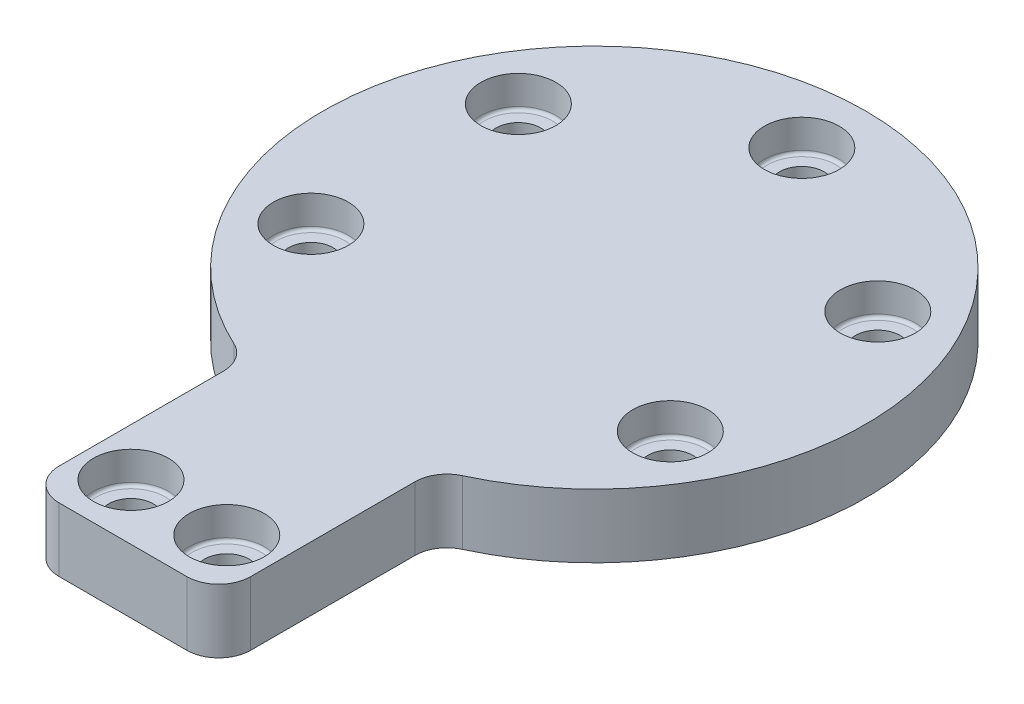
ISO-10303-21;
HEADER;
FILE_DESCRIPTION(('STEP AP214'),'2;1');
FILE_NAME('part.step','',(''),(''),'','','');
FILE_SCHEMA(('AUTOMOTIVE_DESIGN { 1 0 10303 214 1 1 1 1 }'));
ENDSEC;
DATA;
#1=APPLICATION_CONTEXT('core data for automotive mechanical design processes');
#2=APPLICATION_PROTOCOL_DEFINITION('international standard','automotive_design',2000,#1);
#3=PRODUCT_CONTEXT('',#1,'mechanical');
#4=PRODUCT('Part','Part','',(#3));
#5=PRODUCT_RELATED_PRODUCT_CATEGORY('part','',(#4));
#6=PRODUCT_DEFINITION_FORMATION('','',#4);
#7=PRODUCT_DEFINITION_CONTEXT('part definition',#1,'design');
#8=PRODUCT_DEFINITION('design','',#6,#7);
#9=PRODUCT_DEFINITION_SHAPE('','',#8);
#10=(LENGTH_UNIT() NAMED_UNIT(*) SI_UNIT(.MILLI.,.METRE.));
#11=(NAMED_UNIT(*) PLANE_ANGLE_UNIT() SI_UNIT($,.RADIAN.));
#12=(NAMED_UNIT(*) SI_UNIT($,.STERADIAN.) SOLID_ANGLE_UNIT());
#13=UNCERTAINTY_MEASURE_WITH_UNIT(LENGTH_MEASURE(1.E-05),#10,'distance_accuracy_value','');
#14=(GEOMETRIC_REPRESENTATION_CONTEXT(3) GLOBAL_UNCERTAINTY_ASSIGNED_CONTEXT((#13)) GLOBAL_UNIT_ASSIGNED_CONTEXT((#10,
#11,#12)) REPRESENTATION_CONTEXT('',''));
#15=CARTESIAN_POINT('',(0.,0.,0.));
#16=DIRECTION('',(0.,0.,1.));
#17=DIRECTION('',(1.,0.,0.));
#18=AXIS2_PLACEMENT_3D('',#15,#16,#17);
#19=CARTESIAN_POINT('',(3.,4.,26.03));
#20=DIRECTION('',(0.,-1.,0.));
#21=DIRECTION('',(0.,0.,-1.));
#22=AXIS2_PLACEMENT_3D('',#19,#20,#21);
#23=CYLINDRICAL_SURFACE('',#22,1.4);
#24=CARTESIAN_POINT('',(3.,0.,26.03));
#25=DIRECTION('',(0.,1.,0.));
#26=DIRECTION('',(0.,0.,1.));
#27=AXIS2_PLACEMENT_3D('',#24,#25,#26);
#28=CIRCLE('',#27,1.4);
#29=CARTESIAN_POINT('',(3.,0.,27.43));
#30=VERTEX_POINT('',#29);
#31=EDGE_CURVE('E236',#30,#30,#28,.T.);
#32=ORIENTED_EDGE('',*,*,#31,.F.);
#33=EDGE_LOOP('',(#32));
#34=FACE_BOUND('',#33,.T.);
#35=CARTESIAN_POINT('',(3.,2.,26.03));
#36=DIRECTION('',(0.,1.,0.));
#37=DIRECTION('',(0.,0.,1.));
#38=AXIS2_PLACEMENT_3D('',#35,#36,#37);
#39=CIRCLE('',#38,1.4);
#40=CARTESIAN_POINT('',(3.,2.,27.43));
#41=VERTEX_POINT('',#40);
#42=EDGE_CURVE('E157',#41,#41,#39,.T.);
#43=ORIENTED_EDGE('',*,*,#42,.T.);
#44=EDGE_LOOP('',(#43));
#45=FACE_BOUND('',#44,.T.);
#46=ADVANCED_FACE('F42',(#34,#45),#23,.F.);
#47=CARTESIAN_POINT('',(-3.,4.,26.03));
#48=DIRECTION('',(0.,-1.,0.));
#49=DIRECTION('',(0.,0.,-1.));
#50=AXIS2_PLACEMENT_3D('',#47,#48,#49);
#51=CYLINDRICAL_SURFACE('',#50,1.4);
#52=CARTESIAN_POINT('',(-3.,0.,26.03));
#53=DIRECTION('',(0.,1.,0.));
#54=DIRECTION('',(0.,0.,1.));
#55=AXIS2_PLACEMENT_3D('',#52,#53,#54);
#56=CIRCLE('',#55,1.4);
#57=CARTESIAN_POINT('',(-3.,0.,27.43));
#58=VERTEX_POINT('',#57);
#59=EDGE_CURVE('E260',#58,#58,#56,.T.);
#60=ORIENTED_EDGE('',*,*,#59,.F.);
#61=EDGE_LOOP('',(#60));
#62=FACE_BOUND('',#61,.T.);
#63=CARTESIAN_POINT('',(-3.,2.,26.03));
#64=DIRECTION('',(0.,1.,0.));
#65=DIRECTION('',(0.,0.,1.));
#66=AXIS2_PLACEMENT_3D('',#63,#64,#65);
#67=CIRCLE('',#66,1.4);
#68=CARTESIAN_POINT('',(-3.,2.,27.43));
#69=VERTEX_POINT('',#68);
#70=EDGE_CURVE('E154',#69,#69,#67,.T.);
#71=ORIENTED_EDGE('',*,*,#70,.T.);
#72=EDGE_LOOP('',(#71));
#73=FACE_BOUND('',#72,.T.);
#74=ADVANCED_FACE('F333',(#62,#73),#51,.F.);
#75=CARTESIAN_POINT('',(0.,4.,-13.));
#76=DIRECTION('',(0.,-1.,0.));
#77=DIRECTION('',(0.,0.,-1.));
#78=AXIS2_PLACEMENT_3D('',#75,#76,#77);
#79=CYLINDRICAL_SURFACE('',#78,1.4);
#80=CARTESIAN_POINT('',(0.,0.,-13.));
#81=DIRECTION('',(0.,1.,0.));
#82=DIRECTION('',(0.,0.,1.));
#83=AXIS2_PLACEMENT_3D('',#80,#81,#82);
#84=CIRCLE('',#83,1.4);
#85=CARTESIAN_POINT('',(0.,0.,-11.6));
#86=VERTEX_POINT('',#85);
#87=EDGE_CURVE('E263',#86,#86,#84,.T.);
#88=ORIENTED_EDGE('',*,*,#87,.F.);
#89=EDGE_LOOP('',(#88));
#90=FACE_BOUND('',#89,.T.);
#91=CARTESIAN_POINT('',(0.,2.,-13.));
#92=DIRECTION('',(0.,1.,0.));
#93=DIRECTION('',(0.,0.,1.));
#94=AXIS2_PLACEMENT_3D('',#91,#92,#93);
#95=CIRCLE('',#94,1.4);
#96=CARTESIAN_POINT('',(0.,2.,-11.6));
#97=VERTEX_POINT('',#96);
#98=EDGE_CURVE('E151',#97,#97,#95,.T.);
#99=ORIENTED_EDGE('',*,*,#98,.T.);
#100=EDGE_LOOP('',(#99));
#101=FACE_BOUND('',#100,.T.);
#102=ADVANCED_FACE('F340',(#90,#101),#79,.F.);
#103=CARTESIAN_POINT('',(11.2583302491977,4.,6.50000000000005));
#104=DIRECTION('',(0.,-1.,0.));
#105=DIRECTION('',(0.,0.,-1.));
#106=AXIS2_PLACEMENT_3D('',#103,#104,#105);
#107=CYLINDRICAL_SURFACE('',#106,1.4);
#108=CARTESIAN_POINT('',(11.2583302491977,0.,6.50000000000005));
#109=DIRECTION('',(0.,1.,0.));
#110=DIRECTION('',(0.,0.,1.));
#111=AXIS2_PLACEMENT_3D('',#108,#109,#110);
#112=CIRCLE('',#111,1.4);
#113=CARTESIAN_POINT('',(11.2583302491977,0.,7.90000000000005));
#114=VERTEX_POINT('',#113);
#115=EDGE_CURVE('E266',#114,#114,#112,.T.);
#116=ORIENTED_EDGE('',*,*,#115,.F.);
#117=EDGE_LOOP('',(#116));
#118=FACE_BOUND('',#117,.T.);
#119=CARTESIAN_POINT('',(11.2583302491977,2.,6.50000000000005));
#120=DIRECTION('',(0.,1.,0.));
#121=DIRECTION('',(0.,0.,1.));
#122=AXIS2_PLACEMENT_3D('',#119,#120,#121);
#123=CIRCLE('',#122,1.4);
#124=CARTESIAN_POINT('',(11.2583302491977,2.,7.90000000000005));
#125=VERTEX_POINT('',#124);
#126=EDGE_CURVE('E148',#125,#125,#123,.T.);
#127=ORIENTED_EDGE('',*,*,#126,.T.);
#128=EDGE_LOOP('',(#127));
#129=FACE_BOUND('',#128,.T.);
#130=ADVANCED_FACE('F582',(#118,#129),#107,.F.);
#131=CARTESIAN_POINT('',(-11.2583302491977,4.,6.49999999999998));
#132=DIRECTION('',(0.,-1.,0.));
#133=DIRECTION('',(0.,0.,-1.));
#134=AXIS2_PLACEMENT_3D('',#131,#132,#133);
#135=CYLINDRICAL_SURFACE('',#134,1.4);
#136=CARTESIAN_POINT('',(-11.2583302491977,0.,6.49999999999998));
#137=DIRECTION('',(0.,1.,0.));
#138=DIRECTION('',(0.,0.,1.));
#139=AXIS2_PLACEMENT_3D('',#136,#137,#138);
#140=CIRCLE('',#139,1.4);
#141=CARTESIAN_POINT('',(-11.2583302491977,0.,7.89999999999997));
#142=VERTEX_POINT('',#141);
#143=EDGE_CURVE('E269',#142,#142,#140,.T.);
#144=ORIENTED_EDGE('',*,*,#143,.F.);
#145=EDGE_LOOP('',(#144));
#146=FACE_BOUND('',#145,.T.);
#147=CARTESIAN_POINT('',(-11.2583302491977,2.,6.49999999999998));
#148=DIRECTION('',(0.,1.,0.));
#149=DIRECTION('',(0.,0.,1.));
#150=AXIS2_PLACEMENT_3D('',#147,#148,#149);
#151=CIRCLE('',#150,1.4);
#152=CARTESIAN_POINT('',(-11.2583302491977,2.,7.89999999999997));
#153=VERTEX_POINT('',#152);
#154=EDGE_CURVE('E145',#153,#153,#151,.T.);
#155=ORIENTED_EDGE('',*,*,#154,.T.);
#156=EDGE_LOOP('',(#155));
#157=FACE_BOUND('',#156,.T.);
#158=ADVANCED_FACE('F590',(#146,#157),#135,.F.);
#159=CARTESIAN_POINT('',(-11.2583302491977,4.,-6.49999999999997));
#160=DIRECTION('',(0.,-1.,0.));
#161=DIRECTION('',(0.,0.,-1.));
#162=AXIS2_PLACEMENT_3D('',#159,#160,#161);
#163=CYLINDRICAL_SURFACE('',#162,1.4);
#164=CARTESIAN_POINT('',(-11.2583302491977,0.,-6.49999999999997));
#165=DIRECTION('',(0.,1.,0.));
#166=DIRECTION('',(0.,0.,1.));
#167=AXIS2_PLACEMENT_3D('',#164,#165,#166);
#168=CIRCLE('',#167,1.4);
#169=CARTESIAN_POINT('',(-11.2583302491977,0.,-5.09999999999997));
#170=VERTEX_POINT('',#169);
#171=EDGE_CURVE('E272',#170,#170,#168,.T.);
#172=ORIENTED_EDGE('',*,*,#171,.F.);
#173=EDGE_LOOP('',(#172));
#174=FACE_BOUND('',#173,.T.);
#175=CARTESIAN_POINT('',(-11.2583302491977,2.,-6.49999999999997));
#176=DIRECTION('',(0.,1.,0.));
#177=DIRECTION('',(0.,0.,1.));
#178=AXIS2_PLACEMENT_3D('',#175,#176,#177);
#179=CIRCLE('',#178,1.4);
#180=CARTESIAN_POINT('',(-11.2583302491977,2.,-5.09999999999997));
#181=VERTEX_POINT('',#180);
#182=EDGE_CURVE('E141',#181,#181,#179,.T.);
#183=ORIENTED_EDGE('',*,*,#182,.T.);
#184=EDGE_LOOP('',(#183));
#185=FACE_BOUND('',#184,.T.);
#186=ADVANCED_FACE('F599',(#174,#185),#163,.F.);
#187=CARTESIAN_POINT('',(11.2583302491977,4.,-6.49999999999998));
#188=DIRECTION('',(0.,-1.,0.));
#189=DIRECTION('',(0.,0.,-1.));
#190=AXIS2_PLACEMENT_3D('',#187,#188,#189);
#191=CYLINDRICAL_SURFACE('',#190,1.4);
#192=CARTESIAN_POINT('',(11.2583302491977,0.,-6.49999999999998));
#193=DIRECTION('',(0.,1.,0.));
#194=DIRECTION('',(0.,0.,1.));
#195=AXIS2_PLACEMENT_3D('',#192,#193,#194);
#196=CIRCLE('',#195,1.4);
#197=CARTESIAN_POINT('',(11.2583302491977,0.,-5.09999999999998));
#198=VERTEX_POINT('',#197);
#199=EDGE_CURVE('E159',#198,#198,#196,.T.);
#200=ORIENTED_EDGE('',*,*,#199,.F.);
#201=EDGE_LOOP('',(#200));
#202=FACE_BOUND('',#201,.T.);
#203=CARTESIAN_POINT('',(11.2583302491977,2.,-6.49999999999998));
#204=DIRECTION('',(0.,1.,0.));
#205=DIRECTION('',(0.,0.,1.));
#206=AXIS2_PLACEMENT_3D('',#203,#204,#205);
#207=CIRCLE('',#206,1.4);
#208=CARTESIAN_POINT('',(11.2583302491977,2.,-5.09999999999998));
#209=VERTEX_POINT('',#208);
#210=EDGE_CURVE('E138',#209,#209,#207,.T.);
#211=ORIENTED_EDGE('',*,*,#210,.T.);
#212=EDGE_LOOP('',(#211));
#213=FACE_BOUND('',#212,.T.);
#214=ADVANCED_FACE('F302',(#202,#213),#191,.F.);
#215=CARTESIAN_POINT('',(-4.,4.,27.53));
#216=DIRECTION('',(0.,1.,0.));
#217=DIRECTION('',(0.,0.,1.));
#218=AXIS2_PLACEMENT_3D('',#215,#216,#217);
#219=PLANE('',#218);
#220=CARTESIAN_POINT('',(0.,4.,-13.));
#221=DIRECTION('',(0.,1.,0.));
#222=DIRECTION('',(0.,0.,1.));
#223=AXIS2_PLACEMENT_3D('',#220,#221,#222);
#224=CIRCLE('',#223,2.35);
#225=CARTESIAN_POINT('',(0.,4.,-10.65));
#226=VERTEX_POINT('',#225);
#227=EDGE_CURVE('E142',#226,#226,#224,.T.);
#228=ORIENTED_EDGE('',*,*,#227,.F.);
#229=EDGE_LOOP('',(#228));
#230=FACE_BOUND('',#229,.T.);
#231=CARTESIAN_POINT('',(11.2583302491977,4.,-6.49999999999998));
#232=DIRECTION('',(0.,1.,0.));
#233=DIRECTION('',(0.,0.,1.));
#234=AXIS2_PLACEMENT_3D('',#231,#232,#233);
#235=CIRCLE('',#234,2.35);
#236=CARTESIAN_POINT('',(11.2583302491977,4.,-4.14999999999997));
#237=VERTEX_POINT('',#236);
#238=EDGE_CURVE('E292',#237,#237,#235,.T.);
#239=ORIENTED_EDGE('',*,*,#238,.F.);
#240=EDGE_LOOP('',(#239));
#241=FACE_BOUND('',#240,.T.);
#242=CARTESIAN_POINT('',(11.2583302491977,4.,6.50000000000005));
#243=DIRECTION('',(0.,1.,0.));
#244=DIRECTION('',(0.,0.,1.));
#245=AXIS2_PLACEMENT_3D('',#242,#243,#244);
#246=CIRCLE('',#245,2.35);
#247=CARTESIAN_POINT('',(11.2583302491977,4.,8.85000000000005));
#248=VERTEX_POINT('',#247);
#249=EDGE_CURVE('E289',#248,#248,#246,.T.);
#250=ORIENTED_EDGE('',*,*,#249,.F.);
#251=EDGE_LOOP('',(#250));
#252=FACE_BOUND('',#251,.T.);
#253=CARTESIAN_POINT('',(-11.2583302491977,4.,6.49999999999998));
#254=DIRECTION('',(0.,1.,0.));
#255=DIRECTION('',(0.,0.,1.));
#256=AXIS2_PLACEMENT_3D('',#253,#254,#255);
#257=CIRCLE('',#256,2.35);
#258=CARTESIAN_POINT('',(-11.2583302491977,4.,8.84999999999998));
#259=VERTEX_POINT('',#258);
#260=EDGE_CURVE('E286',#259,#259,#257,.T.);
#261=ORIENTED_EDGE('',*,*,#260,.F.);
#262=EDGE_LOOP('',(#261));
#263=FACE_BOUND('',#262,.T.);
#264=CARTESIAN_POINT('',(-11.2583302491977,4.,-6.49999999999997));
#265=DIRECTION('',(0.,1.,0.));
#266=DIRECTION('',(0.,0.,1.));
#267=AXIS2_PLACEMENT_3D('',#264,#265,#266);
#268=CIRCLE('',#267,2.35);
#269=CARTESIAN_POINT('',(-11.2583302491977,4.,-4.14999999999997));
#270=VERTEX_POINT('',#269);
#271=EDGE_CURVE('E283',#270,#270,#268,.T.);
#272=ORIENTED_EDGE('',*,*,#271,.F.);
#273=EDGE_LOOP('',(#272));
#274=FACE_BOUND('',#273,.T.);
#275=CARTESIAN_POINT('',(-3.,4.,26.03));
#276=DIRECTION('',(0.,1.,0.));
#277=DIRECTION('',(0.,0.,1.));
#278=AXIS2_PLACEMENT_3D('',#275,#276,#277);
#279=CIRCLE('',#278,2.35);
#280=CARTESIAN_POINT('',(-3.,4.,28.38));
#281=VERTEX_POINT('',#280);
#282=EDGE_CURVE('E280',#281,#281,#279,.T.);
#283=ORIENTED_EDGE('',*,*,#282,.F.);
#284=EDGE_LOOP('',(#283));
#285=FACE_BOUND('',#284,.T.);
#286=CARTESIAN_POINT('',(3.,4.,26.03));
#287=DIRECTION('',(0.,1.,0.));
#288=DIRECTION('',(0.,0.,1.));
#289=AXIS2_PLACEMENT_3D('',#286,#287,#288);
#290=CIRCLE('',#289,2.35);
#291=CARTESIAN_POINT('',(3.,4.,28.38));
#292=VERTEX_POINT('',#291);
#293=EDGE_CURVE('E277',#292,#292,#290,.T.);
#294=ORIENTED_EDGE('',*,*,#293,.F.);
#295=EDGE_LOOP('',(#294));
#296=FACE_BOUND('',#295,.T.);
#297=CARTESIAN_POINT('',(-4.,4.,27.53));
#298=DIRECTION('',(0.,1.,0.));
#299=DIRECTION('',(0.,0.,1.));
#300=AXIS2_PLACEMENT_3D('',#297,#298,#299);
#301=CIRCLE('',#300,2.);
#302=CARTESIAN_POINT('',(-6.,4.,27.53));
#303=VERTEX_POINT('',#302);
#304=CARTESIAN_POINT('',(-4.,4.,29.53));
#305=VERTEX_POINT('',#304);
#306=EDGE_CURVE('E116',#303,#305,#301,.T.);
#307=ORIENTED_EDGE('',*,*,#306,.T.);
#308=DIRECTION('',(1.,0.,0.));
#309=VECTOR('',#308,1.);
#310=CARTESIAN_POINT('',(-4.,4.,29.53));
#311=LINE('',#310,#309);
#312=CARTESIAN_POINT('',(4.,4.,29.53));
#313=VERTEX_POINT('',#312);
#314=EDGE_CURVE('E106',#305,#313,#311,.T.);
#315=ORIENTED_EDGE('',*,*,#314,.T.);
#316=CARTESIAN_POINT('',(4.,4.,27.53));
#317=DIRECTION('',(0.,1.,0.));
#318=DIRECTION('',(0.,0.,-1.));
#319=AXIS2_PLACEMENT_3D('',#316,#317,#318);
#320=CIRCLE('',#319,2.);
#321=CARTESIAN_POINT('',(6.,4.,27.53));
#322=VERTEX_POINT('',#321);
#323=EDGE_CURVE('E115',#313,#322,#320,.T.);
#324=ORIENTED_EDGE('',*,*,#323,.T.);
#325=DIRECTION('',(0.,0.,-1.));
#326=VECTOR('',#325,1.);
#327=CARTESIAN_POINT('',(6.,4.,22.03));
#328=LINE('',#327,#326);
#329=CARTESIAN_POINT('',(6.,4.,17.2336879396141));
#330=VERTEX_POINT('',#329);
#331=EDGE_CURVE('E230',#322,#330,#328,.T.);
#332=ORIENTED_EDGE('',*,*,#331,.T.);
#333=CARTESIAN_POINT('',(8.,4.,17.2336879396141));
#334=DIRECTION('',(0.,1.,0.));
#335=DIRECTION('',(0.,0.,1.));
#336=AXIS2_PLACEMENT_3D('',#333,#334,#335);
#337=CIRCLE('',#336,2.);
#338=CARTESIAN_POINT('',(7.15789473684211,4.,15.4196155249179));
#339=VERTEX_POINT('',#338);
#340=EDGE_CURVE('E210',#330,#339,#337,.F.);
#341=ORIENTED_EDGE('',*,*,#340,.T.);
#342=CARTESIAN_POINT('',(0.,4.,0.));
#343=DIRECTION('',(0.,1.,0.));
#344=DIRECTION('',(0.,0.,-1.));
#345=AXIS2_PLACEMENT_3D('',#342,#343,#344);
#346=CIRCLE('',#345,17.);
#347=CARTESIAN_POINT('',(-7.1578947368421,4.,15.4196155249179));
#348=VERTEX_POINT('',#347);
#349=EDGE_CURVE('E227',#339,#348,#346,.T.);
#350=ORIENTED_EDGE('',*,*,#349,.T.);
#351=CARTESIAN_POINT('',(-8.,4.,17.2336879396141));
#352=DIRECTION('',(0.,1.,0.));
#353=DIRECTION('',(0.,0.,1.));
#354=AXIS2_PLACEMENT_3D('',#351,#352,#353);
#355=CIRCLE('',#354,2.);
#356=CARTESIAN_POINT('',(-6.,4.,17.2336879396141));
#357=VERTEX_POINT('',#356);
#358=EDGE_CURVE('E11',#348,#357,#355,.F.);
#359=ORIENTED_EDGE('',*,*,#358,.T.);
#360=DIRECTION('',(0.,0.,1.));
#361=VECTOR('',#360,1.);
#362=CARTESIAN_POINT('',(-6.,4.,22.03));
#363=LINE('',#362,#361);
#364=EDGE_CURVE('E120',#357,#303,#363,.T.);
#365=ORIENTED_EDGE('',*,*,#364,.T.);
#366=EDGE_LOOP('',(#307,#315,#324,#332,#341,#350,#359,#365));
#367=FACE_BOUND('',#366,.T.);
#368=ADVANCED_FACE('F119',(#230,#241,#252,#263,#274,#285,#296,#367),#219,.T.);
#369=CARTESIAN_POINT('',(-4.,0.,27.53));
#370=DIRECTION('',(0.,1.,0.));
#371=DIRECTION('',(0.,0.,1.));
#372=AXIS2_PLACEMENT_3D('',#369,#370,#371);
#373=PLANE('',#372);
#374=CARTESIAN_POINT('',(-4.,0.,27.53));
#375=DIRECTION('',(0.,1.,0.));
#376=DIRECTION('',(0.,0.,1.));
#377=AXIS2_PLACEMENT_3D('',#374,#375,#376);
#378=CIRCLE('',#377,2.);
#379=CARTESIAN_POINT('',(-6.,0.,27.53));
#380=VERTEX_POINT('',#379);
#381=CARTESIAN_POINT('',(-4.,0.,29.53));
#382=VERTEX_POINT('',#381);
#383=EDGE_CURVE('E128',#380,#382,#378,.T.);
#384=ORIENTED_EDGE('',*,*,#383,.F.);
#385=DIRECTION('',(0.,0.,1.));
#386=VECTOR('',#385,1.);
#387=CARTESIAN_POINT('',(-6.,0.,22.03));
#388=LINE('',#387,#386);
#389=CARTESIAN_POINT('',(-6.,0.,17.2336879396141));
#390=VERTEX_POINT('',#389);
#391=EDGE_CURVE('E124',#390,#380,#388,.T.);
#392=ORIENTED_EDGE('',*,*,#391,.F.);
#393=CARTESIAN_POINT('',(-8.,0.,17.2336879396141));
#394=DIRECTION('',(0.,1.,0.));
#395=DIRECTION('',(0.,0.,1.));
#396=AXIS2_PLACEMENT_3D('',#393,#394,#395);
#397=CIRCLE('',#396,2.);
#398=CARTESIAN_POINT('',(-7.1578947368421,0.,15.4196155249179));
#399=VERTEX_POINT('',#398);
#400=EDGE_CURVE('E50',#390,#399,#397,.T.);
#401=ORIENTED_EDGE('',*,*,#400,.T.);
#402=CARTESIAN_POINT('',(0.,0.,0.));
#403=DIRECTION('',(0.,1.,0.));
#404=DIRECTION('',(0.,0.,-1.));
#405=AXIS2_PLACEMENT_3D('',#402,#403,#404);
#406=CIRCLE('',#405,17.);
#407=CARTESIAN_POINT('',(7.15789473684211,0.,15.4196155249179));
#408=VERTEX_POINT('',#407);
#409=EDGE_CURVE('E217',#408,#399,#406,.T.);
#410=ORIENTED_EDGE('',*,*,#409,.F.);
#411=CARTESIAN_POINT('',(8.,0.,17.2336879396141));
#412=DIRECTION('',(0.,1.,0.));
#413=DIRECTION('',(0.,0.,1.));
#414=AXIS2_PLACEMENT_3D('',#411,#412,#413);
#415=CIRCLE('',#414,2.);
#416=CARTESIAN_POINT('',(6.,0.,17.2336879396141));
#417=VERTEX_POINT('',#416);
#418=EDGE_CURVE('E208',#408,#417,#415,.T.);
#419=ORIENTED_EDGE('',*,*,#418,.T.);
#420=DIRECTION('',(0.,0.,-1.));
#421=VECTOR('',#420,1.);
#422=CARTESIAN_POINT('',(6.,0.,22.03));
#423=LINE('',#422,#421);
#424=CARTESIAN_POINT('',(6.,0.,27.53));
#425=VERTEX_POINT('',#424);
#426=EDGE_CURVE('E222',#425,#417,#423,.T.);
#427=ORIENTED_EDGE('',*,*,#426,.F.);
#428=CARTESIAN_POINT('',(4.,0.,27.53));
#429=DIRECTION('',(0.,1.,0.));
#430=DIRECTION('',(0.,0.,-1.));
#431=AXIS2_PLACEMENT_3D('',#428,#429,#430);
#432=CIRCLE('',#431,2.);
#433=CARTESIAN_POINT('',(4.,0.,29.53));
#434=VERTEX_POINT('',#433);
#435=EDGE_CURVE('E238',#434,#425,#432,.T.);
#436=ORIENTED_EDGE('',*,*,#435,.F.);
#437=DIRECTION('',(1.,0.,0.));
#438=VECTOR('',#437,1.);
#439=CARTESIAN_POINT('',(-4.,0.,29.53));
#440=LINE('',#439,#438);
#441=EDGE_CURVE('E235',#382,#434,#440,.T.);
#442=ORIENTED_EDGE('',*,*,#441,.F.);
#443=EDGE_LOOP('',(#384,#392,#401,#410,#419,#427,#436,#442));
#444=FACE_BOUND('',#443,.T.);
#445=ORIENTED_EDGE('',*,*,#31,.T.);
#446=EDGE_LOOP('',(#445));
#447=FACE_BOUND('',#446,.T.);
#448=ORIENTED_EDGE('',*,*,#59,.T.);
#449=EDGE_LOOP('',(#448));
#450=FACE_BOUND('',#449,.T.);
#451=ORIENTED_EDGE('',*,*,#87,.T.);
#452=EDGE_LOOP('',(#451));
#453=FACE_BOUND('',#452,.T.);
#454=ORIENTED_EDGE('',*,*,#115,.T.);
#455=EDGE_LOOP('',(#454));
#456=FACE_BOUND('',#455,.T.);
#457=ORIENTED_EDGE('',*,*,#143,.T.);
#458=EDGE_LOOP('',(#457));
#459=FACE_BOUND('',#458,.T.);
#460=ORIENTED_EDGE('',*,*,#171,.T.);
#461=EDGE_LOOP('',(#460));
#462=FACE_BOUND('',#461,.T.);
#463=ORIENTED_EDGE('',*,*,#199,.T.);
#464=EDGE_LOOP('',(#463));
#465=FACE_BOUND('',#464,.T.);
#466=ADVANCED_FACE('F215',(#444,#447,#450,#453,#456,#459,#462,#465),#373,.F.);
#467=CARTESIAN_POINT('',(-4.,4.,27.53));
#468=DIRECTION('',(0.,-1.,0.));
#469=DIRECTION('',(0.,0.,-1.));
#470=AXIS2_PLACEMENT_3D('',#467,#468,#469);
#471=CYLINDRICAL_SURFACE('',#470,2.);
#472=ORIENTED_EDGE('',*,*,#383,.T.);
#473=DIRECTION('',(0.,-1.,0.));
#474=VECTOR('',#473,1.);
#475=CARTESIAN_POINT('',(-4.,4.,29.53));
#476=LINE('',#475,#474);
#477=EDGE_CURVE('E110',#305,#382,#476,.T.);
#478=ORIENTED_EDGE('',*,*,#477,.F.);
#479=ORIENTED_EDGE('',*,*,#306,.F.);
#480=DIRECTION('',(0.,-1.,0.));
#481=VECTOR('',#480,1.);
#482=CARTESIAN_POINT('',(-6.,4.,27.53));
#483=LINE('',#482,#481);
#484=EDGE_CURVE('E226',#303,#380,#483,.T.);
#485=ORIENTED_EDGE('',*,*,#484,.T.);
#486=EDGE_LOOP('',(#472,#478,#479,#485));
#487=FACE_BOUND('',#486,.T.);
#488=ADVANCED_FACE('F126',(#487),#471,.T.);
#489=CARTESIAN_POINT('',(-4.,4.,29.53));
#490=DIRECTION('',(0.,0.,-1.));
#491=DIRECTION('',(-1.,0.,0.));
#492=AXIS2_PLACEMENT_3D('',#489,#490,#491);
#493=PLANE('',#492);
#494=ORIENTED_EDGE('',*,*,#441,.T.);
#495=DIRECTION('',(0.,-1.,0.));
#496=VECTOR('',#495,1.);
#497=CARTESIAN_POINT('',(4.,4.,29.53));
#498=LINE('',#497,#496);
#499=EDGE_CURVE('E113',#313,#434,#498,.T.);
#500=ORIENTED_EDGE('',*,*,#499,.F.);
#501=ORIENTED_EDGE('',*,*,#314,.F.);
#502=ORIENTED_EDGE('',*,*,#477,.T.);
#503=EDGE_LOOP('',(#494,#500,#501,#502));
#504=FACE_BOUND('',#503,.T.);
#505=ADVANCED_FACE('F108',(#504),#493,.F.);
#506=CARTESIAN_POINT('',(4.,4.,27.53));
#507=DIRECTION('',(0.,-1.,0.));
#508=DIRECTION('',(0.,0.,-1.));
#509=AXIS2_PLACEMENT_3D('',#506,#507,#508);
#510=CYLINDRICAL_SURFACE('',#509,2.);
#511=ORIENTED_EDGE('',*,*,#435,.T.);
#512=DIRECTION('',(0.,-1.,0.));
#513=VECTOR('',#512,1.);
#514=CARTESIAN_POINT('',(6.,4.,27.53));
#515=LINE('',#514,#513);
#516=EDGE_CURVE('E134',#322,#425,#515,.T.);
#517=ORIENTED_EDGE('',*,*,#516,.F.);
#518=ORIENTED_EDGE('',*,*,#323,.F.);
#519=ORIENTED_EDGE('',*,*,#499,.T.);
#520=EDGE_LOOP('',(#511,#517,#518,#519));
#521=FACE_BOUND('',#520,.T.);
#522=ADVANCED_FACE('F251',(#521),#510,.T.);
#523=CARTESIAN_POINT('',(6.,4.,22.03));
#524=DIRECTION('',(-1.,0.,0.));
#525=DIRECTION('',(0.,0.,1.));
#526=AXIS2_PLACEMENT_3D('',#523,#524,#525);
#527=PLANE('',#526);
#528=ORIENTED_EDGE('',*,*,#426,.T.);
#529=DIRECTION('',(0.,1.,0.));
#530=VECTOR('',#529,1.);
#531=CARTESIAN_POINT('',(6.,4.,17.2336879396141));
#532=LINE('',#531,#530);
#533=EDGE_CURVE('E204',#417,#330,#532,.T.);
#534=ORIENTED_EDGE('',*,*,#533,.T.);
#535=ORIENTED_EDGE('',*,*,#331,.F.);
#536=ORIENTED_EDGE('',*,*,#516,.T.);
#537=EDGE_LOOP('',(#528,#534,#535,#536));
#538=FACE_BOUND('',#537,.T.);
#539=ADVANCED_FACE('F247',(#538),#527,.F.);
#540=CARTESIAN_POINT('',(0.,4.,0.));
#541=DIRECTION('',(0.,-1.,0.));
#542=DIRECTION('',(0.,0.,-1.));
#543=AXIS2_PLACEMENT_3D('',#540,#541,#542);
#544=CYLINDRICAL_SURFACE('',#543,17.);
#545=ORIENTED_EDGE('',*,*,#349,.F.);
#546=DIRECTION('',(0.,-1.,0.));
#547=VECTOR('',#546,1.);
#548=CARTESIAN_POINT('',(7.15789473684211,4.,15.4196155249179));
#549=LINE('',#548,#547);
#550=EDGE_CURVE('E201',#339,#408,#549,.T.);
#551=ORIENTED_EDGE('',*,*,#550,.T.);
#552=ORIENTED_EDGE('',*,*,#409,.T.);
#553=DIRECTION('',(0.,-1.,0.));
#554=VECTOR('',#553,1.);
#555=CARTESIAN_POINT('',(-7.1578947368421,4.,15.4196155249179));
#556=LINE('',#555,#554);
#557=EDGE_CURVE('E199',#399,#348,#556,.F.);
#558=ORIENTED_EDGE('',*,*,#557,.T.);
#559=EDGE_LOOP('',(#545,#551,#552,#558));
#560=FACE_BOUND('',#559,.T.);
#561=ADVANCED_FACE('F220',(#560),#544,.T.);
#562=CARTESIAN_POINT('',(-6.,4.,22.03));
#563=DIRECTION('',(1.,0.,0.));
#564=DIRECTION('',(0.,0.,-1.));
#565=AXIS2_PLACEMENT_3D('',#562,#563,#564);
#566=PLANE('',#565);
#567=ORIENTED_EDGE('',*,*,#364,.F.);
#568=DIRECTION('',(0.,1.,0.));
#569=VECTOR('',#568,1.);
#570=CARTESIAN_POINT('',(-6.,0.,17.2336879396141));
#571=LINE('',#570,#569);
#572=EDGE_CURVE('E206',#357,#390,#571,.F.);
#573=ORIENTED_EDGE('',*,*,#572,.T.);
#574=ORIENTED_EDGE('',*,*,#391,.T.);
#575=ORIENTED_EDGE('',*,*,#484,.F.);
#576=EDGE_LOOP('',(#567,#573,#574,#575));
#577=FACE_BOUND('',#576,.T.);
#578=ADVANCED_FACE('F225',(#577),#566,.F.);
#579=CARTESIAN_POINT('',(11.2583302491977,2.,-6.49999999999998));
#580=DIRECTION('',(0.,1.,0.));
#581=DIRECTION('',(0.,0.,1.));
#582=AXIS2_PLACEMENT_3D('',#579,#580,#581);
#583=CYLINDRICAL_SURFACE('',#582,2.35);
#584=CARTESIAN_POINT('',(11.2583302491977,2.2,-6.49999999999998));
#585=DIRECTION('',(0.,1.,0.));
#586=DIRECTION('',(0.,0.,1.));
#587=AXIS2_PLACEMENT_3D('',#584,#585,#586);
#588=CIRCLE('',#587,2.35);
#589=CARTESIAN_POINT('',(11.2583302491977,2.2,-4.14999999999997));
#590=VERTEX_POINT('',#589);
#591=EDGE_CURVE('E190',#590,#590,#588,.F.);
#592=ORIENTED_EDGE('',*,*,#591,.T.);
#593=EDGE_LOOP('',(#592));
#594=FACE_BOUND('',#593,.T.);
#595=ORIENTED_EDGE('',*,*,#238,.T.);
#596=EDGE_LOOP('',(#595));
#597=FACE_BOUND('',#596,.T.);
#598=ADVANCED_FACE('F351',(#594,#597),#583,.F.);
#599=CARTESIAN_POINT('',(11.2583302491977,2.,-6.49999999999998));
#600=DIRECTION('',(0.,1.,0.));
#601=DIRECTION('',(0.,0.,1.));
#602=AXIS2_PLACEMENT_3D('',#599,#600,#601);
#603=PLANE('',#602);
#604=CARTESIAN_POINT('',(11.2583302491977,2.,-6.49999999999998));
#605=DIRECTION('',(0.,1.,0.));
#606=DIRECTION('',(0.,0.,1.));
#607=AXIS2_PLACEMENT_3D('',#604,#605,#606);
#608=CIRCLE('',#607,2.15);
#609=CARTESIAN_POINT('',(11.2583302491977,2.,-4.34999999999998));
#610=VERTEX_POINT('',#609);
#611=EDGE_CURVE('E187',#610,#610,#608,.T.);
#612=ORIENTED_EDGE('',*,*,#611,.T.);
#613=EDGE_LOOP('',(#612));
#614=FACE_BOUND('',#613,.T.);
#615=ORIENTED_EDGE('',*,*,#210,.F.);
#616=EDGE_LOOP('',(#615));
#617=FACE_BOUND('',#616,.T.);
#618=ADVANCED_FACE('F544',(#614,#617),#603,.T.);
#619=CARTESIAN_POINT('',(-11.2583302491977,2.,-6.49999999999997));
#620=DIRECTION('',(0.,1.,0.));
#621=DIRECTION('',(0.,0.,1.));
#622=AXIS2_PLACEMENT_3D('',#619,#620,#621);
#623=CYLINDRICAL_SURFACE('',#622,2.35);
#624=CARTESIAN_POINT('',(-11.2583302491977,2.2,-6.49999999999997));
#625=DIRECTION('',(0.,1.,0.));
#626=DIRECTION('',(0.,0.,1.));
#627=AXIS2_PLACEMENT_3D('',#624,#625,#626);
#628=CIRCLE('',#627,2.35);
#629=CARTESIAN_POINT('',(-11.2583302491977,2.2,-4.14999999999997));
#630=VERTEX_POINT('',#629);
#631=EDGE_CURVE('E178',#630,#630,#628,.F.);
#632=ORIENTED_EDGE('',*,*,#631,.T.);
#633=EDGE_LOOP('',(#632));
#634=FACE_BOUND('',#633,.T.);
#635=ORIENTED_EDGE('',*,*,#271,.T.);
#636=EDGE_LOOP('',(#635));
#637=FACE_BOUND('',#636,.T.);
#638=ADVANCED_FACE('F534',(#634,#637),#623,.F.);
#639=CARTESIAN_POINT('',(-11.2583302491977,2.,-6.49999999999997));
#640=DIRECTION('',(0.,1.,0.));
#641=DIRECTION('',(0.,0.,1.));
#642=AXIS2_PLACEMENT_3D('',#639,#640,#641);
#643=PLANE('',#642);
#644=CARTESIAN_POINT('',(-11.2583302491977,2.,-6.49999999999997));
#645=DIRECTION('',(0.,1.,0.));
#646=DIRECTION('',(0.,0.,1.));
#647=AXIS2_PLACEMENT_3D('',#644,#645,#646);
#648=CIRCLE('',#647,2.15);
#649=CARTESIAN_POINT('',(-11.2583302491977,2.,-4.34999999999997));
#650=VERTEX_POINT('',#649);
#651=EDGE_CURVE('E175',#650,#650,#648,.T.);
#652=ORIENTED_EDGE('',*,*,#651,.T.);
#653=EDGE_LOOP('',(#652));
#654=FACE_BOUND('',#653,.T.);
#655=ORIENTED_EDGE('',*,*,#182,.F.);
#656=EDGE_LOOP('',(#655));
#657=FACE_BOUND('',#656,.T.);
#658=ADVANCED_FACE('F524',(#654,#657),#643,.T.);
#659=CARTESIAN_POINT('',(-11.2583302491977,2.,6.49999999999998));
#660=DIRECTION('',(0.,1.,0.));
#661=DIRECTION('',(0.,0.,1.));
#662=AXIS2_PLACEMENT_3D('',#659,#660,#661);
#663=CYLINDRICAL_SURFACE('',#662,2.35);
#664=CARTESIAN_POINT('',(-11.2583302491977,2.2,6.49999999999998));
#665=DIRECTION('',(0.,1.,0.));
#666=DIRECTION('',(0.,0.,1.));
#667=AXIS2_PLACEMENT_3D('',#664,#665,#666);
#668=CIRCLE('',#667,2.35);
#669=CARTESIAN_POINT('',(-11.2583302491977,2.2,8.84999999999998));
#670=VERTEX_POINT('',#669);
#671=EDGE_CURVE('E172',#670,#670,#668,.F.);
#672=ORIENTED_EDGE('',*,*,#671,.T.);
#673=EDGE_LOOP('',(#672));
#674=FACE_BOUND('',#673,.T.);
#675=ORIENTED_EDGE('',*,*,#260,.T.);
#676=EDGE_LOOP('',(#675));
#677=FACE_BOUND('',#676,.T.);
#678=ADVANCED_FACE('F514',(#674,#677),#663,.F.);
#679=CARTESIAN_POINT('',(-11.2583302491977,2.,6.49999999999998));
#680=DIRECTION('',(0.,1.,0.));
#681=DIRECTION('',(0.,0.,1.));
#682=AXIS2_PLACEMENT_3D('',#679,#680,#681);
#683=PLANE('',#682);
#684=CARTESIAN_POINT('',(-11.2583302491977,2.,6.49999999999998));
#685=DIRECTION('',(0.,1.,0.));
#686=DIRECTION('',(0.,0.,1.));
#687=AXIS2_PLACEMENT_3D('',#684,#685,#686);
#688=CIRCLE('',#687,2.15);
#689=CARTESIAN_POINT('',(-11.2583302491977,2.,8.64999999999998));
#690=VERTEX_POINT('',#689);
#691=EDGE_CURVE('E169',#690,#690,#688,.T.);
#692=ORIENTED_EDGE('',*,*,#691,.T.);
#693=EDGE_LOOP('',(#692));
#694=FACE_BOUND('',#693,.T.);
#695=ORIENTED_EDGE('',*,*,#154,.F.);
#696=EDGE_LOOP('',(#695));
#697=FACE_BOUND('',#696,.T.);
#698=ADVANCED_FACE('F504',(#694,#697),#683,.T.);
#699=CARTESIAN_POINT('',(11.2583302491977,2.,6.50000000000005));
#700=DIRECTION('',(0.,1.,0.));
#701=DIRECTION('',(0.,0.,1.));
#702=AXIS2_PLACEMENT_3D('',#699,#700,#701);
#703=CYLINDRICAL_SURFACE('',#702,2.35);
#704=CARTESIAN_POINT('',(11.2583302491977,2.2,6.50000000000005));
#705=DIRECTION('',(0.,1.,0.));
#706=DIRECTION('',(0.,0.,1.));
#707=AXIS2_PLACEMENT_3D('',#704,#705,#706);
#708=CIRCLE('',#707,2.35);
#709=CARTESIAN_POINT('',(11.2583302491977,2.2,8.85000000000005));
#710=VERTEX_POINT('',#709);
#711=EDGE_CURVE('E184',#710,#710,#708,.F.);
#712=ORIENTED_EDGE('',*,*,#711,.T.);
#713=EDGE_LOOP('',(#712));
#714=FACE_BOUND('',#713,.T.);
#715=ORIENTED_EDGE('',*,*,#249,.T.);
#716=EDGE_LOOP('',(#715));
#717=FACE_BOUND('',#716,.T.);
#718=ADVANCED_FACE('F494',(#714,#717),#703,.F.);
#719=CARTESIAN_POINT('',(11.2583302491977,2.,6.50000000000005));
#720=DIRECTION('',(0.,1.,0.));
#721=DIRECTION('',(0.,0.,1.));
#722=AXIS2_PLACEMENT_3D('',#719,#720,#721);
#723=PLANE('',#722);
#724=CARTESIAN_POINT('',(11.2583302491977,2.,6.50000000000005));
#725=DIRECTION('',(0.,1.,0.));
#726=DIRECTION('',(0.,0.,1.));
#727=AXIS2_PLACEMENT_3D('',#724,#725,#726);
#728=CIRCLE('',#727,2.15);
#729=CARTESIAN_POINT('',(11.2583302491977,2.,8.65000000000005));
#730=VERTEX_POINT('',#729);
#731=EDGE_CURVE('E181',#730,#730,#728,.T.);
#732=ORIENTED_EDGE('',*,*,#731,.T.);
#733=EDGE_LOOP('',(#732));
#734=FACE_BOUND('',#733,.T.);
#735=ORIENTED_EDGE('',*,*,#126,.F.);
#736=EDGE_LOOP('',(#735));
#737=FACE_BOUND('',#736,.T.);
#738=ADVANCED_FACE('F484',(#734,#737),#723,.T.);
#739=CARTESIAN_POINT('',(0.,2.,-13.));
#740=DIRECTION('',(0.,1.,0.));
#741=DIRECTION('',(0.,0.,1.));
#742=AXIS2_PLACEMENT_3D('',#739,#740,#741);
#743=CYLINDRICAL_SURFACE('',#742,2.35);
#744=CARTESIAN_POINT('',(0.,2.2,-13.));
#745=DIRECTION('',(0.,1.,0.));
#746=DIRECTION('',(0.,0.,1.));
#747=AXIS2_PLACEMENT_3D('',#744,#745,#746);
#748=CIRCLE('',#747,2.35);
#749=CARTESIAN_POINT('',(0.,2.2,-10.65));
#750=VERTEX_POINT('',#749);
#751=EDGE_CURVE('E196',#750,#750,#748,.F.);
#752=ORIENTED_EDGE('',*,*,#751,.T.);
#753=EDGE_LOOP('',(#752));
#754=FACE_BOUND('',#753,.T.);
#755=ORIENTED_EDGE('',*,*,#227,.T.);
#756=EDGE_LOOP('',(#755));
#757=FACE_BOUND('',#756,.T.);
#758=ADVANCED_FACE('F298',(#754,#757),#743,.F.);
#759=CARTESIAN_POINT('',(0.,2.,-13.));
#760=DIRECTION('',(0.,1.,0.));
#761=DIRECTION('',(0.,0.,1.));
#762=AXIS2_PLACEMENT_3D('',#759,#760,#761);
#763=PLANE('',#762);
#764=CARTESIAN_POINT('',(0.,2.,-13.));
#765=DIRECTION('',(0.,1.,0.));
#766=DIRECTION('',(0.,0.,1.));
#767=AXIS2_PLACEMENT_3D('',#764,#765,#766);
#768=CIRCLE('',#767,2.15);
#769=CARTESIAN_POINT('',(0.,2.,-10.85));
#770=VERTEX_POINT('',#769);
#771=EDGE_CURVE('E193',#770,#770,#768,.T.);
#772=ORIENTED_EDGE('',*,*,#771,.T.);
#773=EDGE_LOOP('',(#772));
#774=FACE_BOUND('',#773,.T.);
#775=ORIENTED_EDGE('',*,*,#98,.F.);
#776=EDGE_LOOP('',(#775));
#777=FACE_BOUND('',#776,.T.);
#778=ADVANCED_FACE('F465',(#774,#777),#763,.T.);
#779=CARTESIAN_POINT('',(-3.,2.,26.03));
#780=DIRECTION('',(0.,1.,0.));
#781=DIRECTION('',(0.,0.,1.));
#782=AXIS2_PLACEMENT_3D('',#779,#780,#781);
#783=CYLINDRICAL_SURFACE('',#782,2.35);
#784=CARTESIAN_POINT('',(-3.,2.2,26.03));
#785=DIRECTION('',(0.,1.,0.));
#786=DIRECTION('',(0.,0.,1.));
#787=AXIS2_PLACEMENT_3D('',#784,#785,#786);
#788=CIRCLE('',#787,2.35);
#789=CARTESIAN_POINT('',(-3.,2.2,28.38));
#790=VERTEX_POINT('',#789);
#791=EDGE_CURVE('E132',#790,#790,#788,.F.);
#792=ORIENTED_EDGE('',*,*,#791,.T.);
#793=EDGE_LOOP('',(#792));
#794=FACE_BOUND('',#793,.T.);
#795=ORIENTED_EDGE('',*,*,#282,.T.);
#796=EDGE_LOOP('',(#795));
#797=FACE_BOUND('',#796,.T.);
#798=ADVANCED_FACE('F329',(#794,#797),#783,.F.);
#799=CARTESIAN_POINT('',(-3.,2.,26.03));
#800=DIRECTION('',(0.,1.,0.));
#801=DIRECTION('',(0.,0.,1.));
#802=AXIS2_PLACEMENT_3D('',#799,#800,#801);
#803=PLANE('',#802);
#804=CARTESIAN_POINT('',(-3.,2.,26.03));
#805=DIRECTION('',(0.,1.,0.));
#806=DIRECTION('',(0.,0.,1.));
#807=AXIS2_PLACEMENT_3D('',#804,#805,#806);
#808=CIRCLE('',#807,2.15);
#809=CARTESIAN_POINT('',(-3.,2.,28.18));
#810=VERTEX_POINT('',#809);
#811=EDGE_CURVE('E129',#810,#810,#808,.T.);
#812=ORIENTED_EDGE('',*,*,#811,.T.);
#813=EDGE_LOOP('',(#812));
#814=FACE_BOUND('',#813,.T.);
#815=ORIENTED_EDGE('',*,*,#70,.F.);
#816=EDGE_LOOP('',(#815));
#817=FACE_BOUND('',#816,.T.);
#818=ADVANCED_FACE('F319',(#814,#817),#803,.T.);
#819=CARTESIAN_POINT('',(3.,2.,26.03));
#820=DIRECTION('',(0.,1.,0.));
#821=DIRECTION('',(0.,0.,1.));
#822=AXIS2_PLACEMENT_3D('',#819,#820,#821);
#823=CYLINDRICAL_SURFACE('',#822,2.35);
#824=CARTESIAN_POINT('',(3.,2.2,26.03));
#825=DIRECTION('',(0.,1.,0.));
#826=DIRECTION('',(0.,0.,1.));
#827=AXIS2_PLACEMENT_3D('',#824,#825,#826);
#828=CIRCLE('',#827,2.35);
#829=CARTESIAN_POINT('',(3.,2.2,28.38));
#830=VERTEX_POINT('',#829);
#831=EDGE_CURVE('E166',#830,#830,#828,.F.);
#832=ORIENTED_EDGE('',*,*,#831,.T.);
#833=EDGE_LOOP('',(#832));
#834=FACE_BOUND('',#833,.T.);
#835=ORIENTED_EDGE('',*,*,#293,.T.);
#836=EDGE_LOOP('',(#835));
#837=FACE_BOUND('',#836,.T.);
#838=ADVANCED_FACE('F316',(#834,#837),#823,.F.);
#839=CARTESIAN_POINT('',(3.,2.,26.03));
#840=DIRECTION('',(0.,1.,0.));
#841=DIRECTION('',(0.,0.,1.));
#842=AXIS2_PLACEMENT_3D('',#839,#840,#841);
#843=PLANE('',#842);
#844=CARTESIAN_POINT('',(3.,2.,26.03));
#845=DIRECTION('',(0.,1.,0.));
#846=DIRECTION('',(0.,0.,1.));
#847=AXIS2_PLACEMENT_3D('',#844,#845,#846);
#848=CIRCLE('',#847,2.15);
#849=CARTESIAN_POINT('',(3.,2.,28.18));
#850=VERTEX_POINT('',#849);
#851=EDGE_CURVE('E163',#850,#850,#848,.T.);
#852=ORIENTED_EDGE('',*,*,#851,.T.);
#853=EDGE_LOOP('',(#852));
#854=FACE_BOUND('',#853,.T.);
#855=ORIENTED_EDGE('',*,*,#42,.F.);
#856=EDGE_LOOP('',(#855));
#857=FACE_BOUND('',#856,.T.);
#858=ADVANCED_FACE('F318',(#854,#857),#843,.T.);
#859=CARTESIAN_POINT('',(-3.,2.2,26.03));
#860=DIRECTION('',(0.,1.,0.));
#861=DIRECTION('',(0.,0.,1.));
#862=AXIS2_PLACEMENT_3D('',#859,#860,#861);
#863=TOROIDAL_SURFACE('',#862,2.15,0.2);
#864=ORIENTED_EDGE('',*,*,#791,.F.);
#865=EDGE_LOOP('',(#864));
#866=FACE_BOUND('',#865,.T.);
#867=ORIENTED_EDGE('',*,*,#811,.F.);
#868=EDGE_LOOP('',(#867));
#869=FACE_BOUND('',#868,.T.);
#870=ADVANCED_FACE('F326',(#866,#869),#863,.F.);
#871=CARTESIAN_POINT('',(3.,2.2,26.03));
#872=DIRECTION('',(0.,1.,0.));
#873=DIRECTION('',(0.,0.,1.));
#874=AXIS2_PLACEMENT_3D('',#871,#872,#873);
#875=TOROIDAL_SURFACE('',#874,2.15,0.2);
#876=ORIENTED_EDGE('',*,*,#831,.F.);
#877=EDGE_LOOP('',(#876));
#878=FACE_BOUND('',#877,.T.);
#879=ORIENTED_EDGE('',*,*,#851,.F.);
#880=EDGE_LOOP('',(#879));
#881=FACE_BOUND('',#880,.T.);
#882=ADVANCED_FACE('F363',(#878,#881),#875,.F.);
#883=CARTESIAN_POINT('',(-11.2583302491977,2.2,6.49999999999998));
#884=DIRECTION('',(0.,1.,0.));
#885=DIRECTION('',(0.,0.,1.));
#886=AXIS2_PLACEMENT_3D('',#883,#884,#885);
#887=TOROIDAL_SURFACE('',#886,2.15,0.2);
#888=ORIENTED_EDGE('',*,*,#671,.F.);
#889=EDGE_LOOP('',(#888));
#890=FACE_BOUND('',#889,.T.);
#891=ORIENTED_EDGE('',*,*,#691,.F.);
#892=EDGE_LOOP('',(#891));
#893=FACE_BOUND('',#892,.T.);
#894=ADVANCED_FACE('F367',(#890,#893),#887,.F.);
#895=CARTESIAN_POINT('',(-11.2583302491977,2.2,-6.49999999999997));
#896=DIRECTION('',(0.,1.,0.));
#897=DIRECTION('',(0.,0.,1.));
#898=AXIS2_PLACEMENT_3D('',#895,#896,#897);
#899=TOROIDAL_SURFACE('',#898,2.15,0.2);
#900=ORIENTED_EDGE('',*,*,#631,.F.);
#901=EDGE_LOOP('',(#900));
#902=FACE_BOUND('',#901,.T.);
#903=ORIENTED_EDGE('',*,*,#651,.F.);
#904=EDGE_LOOP('',(#903));
#905=FACE_BOUND('',#904,.T.);
#906=ADVANCED_FACE('F371',(#902,#905),#899,.F.);
#907=CARTESIAN_POINT('',(11.2583302491977,2.2,6.50000000000005));
#908=DIRECTION('',(0.,1.,0.));
#909=DIRECTION('',(0.,0.,1.));
#910=AXIS2_PLACEMENT_3D('',#907,#908,#909);
#911=TOROIDAL_SURFACE('',#910,2.15,0.2);
#912=ORIENTED_EDGE('',*,*,#711,.F.);
#913=EDGE_LOOP('',(#912));
#914=FACE_BOUND('',#913,.T.);
#915=ORIENTED_EDGE('',*,*,#731,.F.);
#916=EDGE_LOOP('',(#915));
#917=FACE_BOUND('',#916,.T.);
#918=ADVANCED_FACE('F375',(#914,#917),#911,.F.);
#919=CARTESIAN_POINT('',(11.2583302491977,2.2,-6.49999999999998));
#920=DIRECTION('',(0.,1.,0.));
#921=DIRECTION('',(0.,0.,1.));
#922=AXIS2_PLACEMENT_3D('',#919,#920,#921);
#923=TOROIDAL_SURFACE('',#922,2.15,0.2);
#924=ORIENTED_EDGE('',*,*,#591,.F.);
#925=EDGE_LOOP('',(#924));
#926=FACE_BOUND('',#925,.T.);
#927=ORIENTED_EDGE('',*,*,#611,.F.);
#928=EDGE_LOOP('',(#927));
#929=FACE_BOUND('',#928,.T.);
#930=ADVANCED_FACE('F379',(#926,#929),#923,.F.);
#931=CARTESIAN_POINT('',(0.,2.2,-13.));
#932=DIRECTION('',(0.,1.,0.));
#933=DIRECTION('',(0.,0.,1.));
#934=AXIS2_PLACEMENT_3D('',#931,#932,#933);
#935=TOROIDAL_SURFACE('',#934,2.15,0.2);
#936=ORIENTED_EDGE('',*,*,#751,.F.);
#937=EDGE_LOOP('',(#936));
#938=FACE_BOUND('',#937,.T.);
#939=ORIENTED_EDGE('',*,*,#771,.F.);
#940=EDGE_LOOP('',(#939));
#941=FACE_BOUND('',#940,.T.);
#942=ADVANCED_FACE('F383',(#938,#941),#935,.F.);
#943=CARTESIAN_POINT('',(8.,4.,17.2336879396141));
#944=DIRECTION('',(0.,-1.,0.));
#945=DIRECTION('',(0.,0.,-1.));
#946=AXIS2_PLACEMENT_3D('',#943,#944,#945);
#947=CYLINDRICAL_SURFACE('',#946,2.);
#948=ORIENTED_EDGE('',*,*,#340,.F.);
#949=ORIENTED_EDGE('',*,*,#533,.F.);
#950=ORIENTED_EDGE('',*,*,#418,.F.);
#951=ORIENTED_EDGE('',*,*,#550,.F.);
#952=EDGE_LOOP('',(#948,#949,#950,#951));
#953=FACE_BOUND('',#952,.T.);
#954=ADVANCED_FACE('F255',(#953),#947,.F.);
#955=CARTESIAN_POINT('',(-8.,4.,17.2336879396141));
#956=DIRECTION('',(0.,-1.,0.));
#957=DIRECTION('',(0.,0.,-1.));
#958=AXIS2_PLACEMENT_3D('',#955,#956,#957);
#959=CYLINDRICAL_SURFACE('',#958,2.);
#960=ORIENTED_EDGE('',*,*,#358,.F.);
#961=ORIENTED_EDGE('',*,*,#557,.F.);
#962=ORIENTED_EDGE('',*,*,#400,.F.);
#963=ORIENTED_EDGE('',*,*,#572,.F.);
#964=EDGE_LOOP('',(#960,#961,#962,#963));
#965=FACE_BOUND('',#964,.T.);
#966=ADVANCED_FACE('F44',(#965),#959,.F.);
#967=CLOSED_SHELL('',(#46,#74,#102,#130,#158,#186,#214,#368,#466,#488,#505,#522,#539,#561,#578,
#598,#618,#638,#658,#678,#698,#718,#738,#758,#778,#798,#818,#838,#858,#870,#882,#894,#906,#918,
#930,#942,#954,#966));
#968=MANIFOLD_SOLID_BREP('B2',#967);
#969=ADVANCED_BREP_SHAPE_REPRESENTATION('',(#18,#968),#14);
#970=SHAPE_DEFINITION_REPRESENTATION(#9,#969);
ENDSEC;
END-ISO-10303-21;
